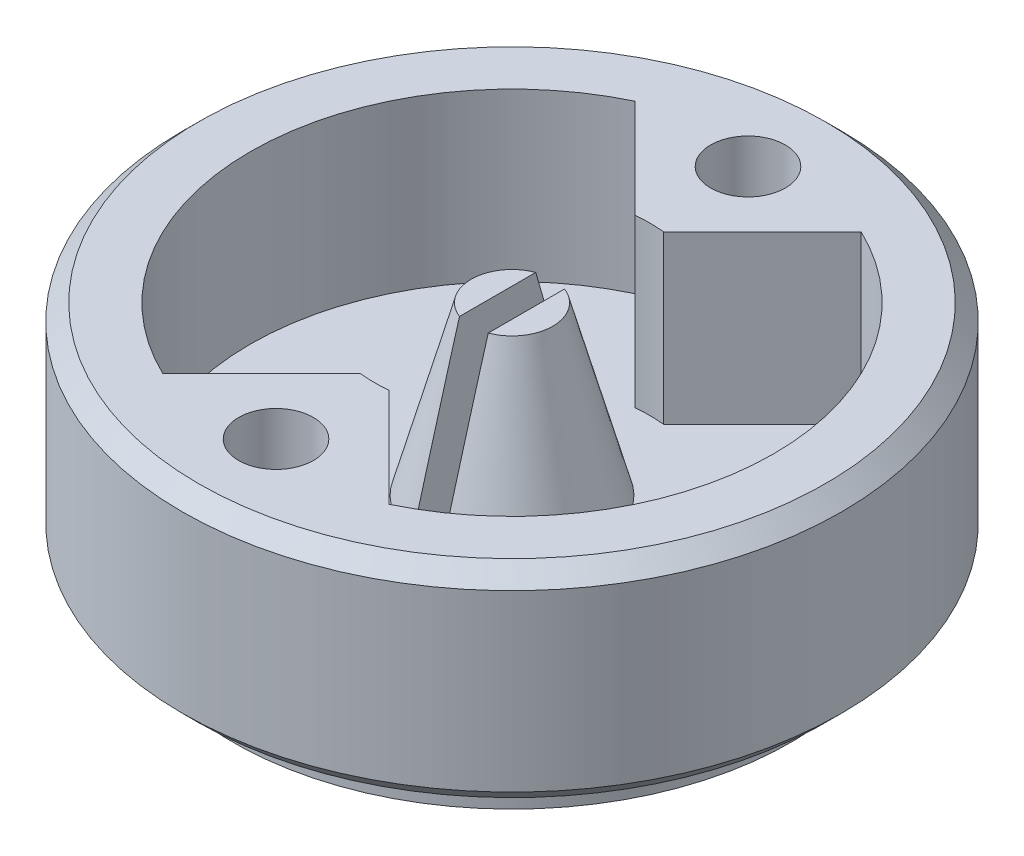
ISO-10303-21;
HEADER;
FILE_DESCRIPTION(('STEP AP214'),'2;1');
FILE_NAME('part.step','',(''),(''),'','','');
FILE_SCHEMA(('AUTOMOTIVE_DESIGN { 1 0 10303 214 1 1 1 1 }'));
ENDSEC;
DATA;
#1=APPLICATION_CONTEXT('core data for automotive mechanical design processes');
#2=APPLICATION_PROTOCOL_DEFINITION('international standard','automotive_design',2000,#1);
#3=PRODUCT_CONTEXT('',#1,'mechanical');
#4=PRODUCT('Part','Part','',(#3));
#5=PRODUCT_RELATED_PRODUCT_CATEGORY('part','',(#4));
#6=PRODUCT_DEFINITION_FORMATION('','',#4);
#7=PRODUCT_DEFINITION_CONTEXT('part definition',#1,'design');
#8=PRODUCT_DEFINITION('design','',#6,#7);
#9=PRODUCT_DEFINITION_SHAPE('','',#8);
#10=(LENGTH_UNIT() NAMED_UNIT(*) SI_UNIT(.MILLI.,.METRE.));
#11=(NAMED_UNIT(*) PLANE_ANGLE_UNIT() SI_UNIT($,.RADIAN.));
#12=(NAMED_UNIT(*) SI_UNIT($,.STERADIAN.) SOLID_ANGLE_UNIT());
#13=UNCERTAINTY_MEASURE_WITH_UNIT(LENGTH_MEASURE(1.E-05),#10,'distance_accuracy_value','');
#14=(GEOMETRIC_REPRESENTATION_CONTEXT(3) GLOBAL_UNCERTAINTY_ASSIGNED_CONTEXT((#13)) GLOBAL_UNIT_ASSIGNED_CONTEXT((#10,
#11,#12)) REPRESENTATION_CONTEXT('',''));
#15=CARTESIAN_POINT('',(0.,0.,0.));
#16=DIRECTION('',(0.,0.,1.));
#17=DIRECTION('',(1.,0.,0.));
#18=AXIS2_PLACEMENT_3D('',#15,#16,#17);
#19=CARTESIAN_POINT('',(0.,18.,0.));
#20=DIRECTION('',(0.,1.,0.));
#21=DIRECTION('',(0.,0.,1.));
#22=AXIS2_PLACEMENT_3D('',#19,#20,#21);
#23=PLANE('',#22);
#24=CARTESIAN_POINT('',(0.,18.,0.));
#25=DIRECTION('',(0.,-1.,0.));
#26=DIRECTION('',(0.,0.,-1.));
#27=AXIS2_PLACEMENT_3D('',#24,#25,#26);
#28=CIRCLE('',#27,27.2618644059249);
#29=CARTESIAN_POINT('',(0.,18.,-27.2618644059249));
#30=VERTEX_POINT('',#29);
#31=EDGE_CURVE('E173',#30,#30,#28,.T.);
#32=ORIENTED_EDGE('',*,*,#31,.F.);
#33=EDGE_LOOP('',(#32));
#34=FACE_BOUND('',#33,.T.);
#35=CARTESIAN_POINT('',(0.,18.,0.));
#36=DIRECTION('',(0.,-1.,0.));
#37=DIRECTION('',(0.,0.,-1.));
#38=AXIS2_PLACEMENT_3D('',#35,#36,#37);
#39=CIRCLE('',#38,22.7618644059249);
#40=CARTESIAN_POINT('',(9.84021095863013,18.,-20.52492922091));
#41=VERTEX_POINT('',#40);
#42=CARTESIAN_POINT('',(9.84021095863014,18.,20.52492922091));
#43=VERTEX_POINT('',#42);
#44=EDGE_CURVE('E170',#41,#43,#39,.T.);
#45=ORIENTED_EDGE('',*,*,#44,.T.);
#46=DIRECTION('',(-0.707106781186551,0.,-0.707106781186544));
#47=VECTOR('',#46,1.);
#48=CARTESIAN_POINT('',(-5.34235913113999,18.,5.34235913114004));
#49=LINE('',#48,#47);
#50=CARTESIAN_POINT('',(1.25000000000005,18.,11.93471826228));
#51=VERTEX_POINT('',#50);
#52=EDGE_CURVE('E551',#43,#51,#49,.T.);
#53=ORIENTED_EDGE('',*,*,#52,.T.);
#54=CARTESIAN_POINT('',(0.,18.,0.));
#55=DIRECTION('',(0.,1.,0.));
#56=DIRECTION('',(0.,0.,1.));
#57=AXIS2_PLACEMENT_3D('',#54,#55,#56);
#58=CIRCLE('',#57,12.);
#59=CARTESIAN_POINT('',(-1.24999999999998,18.,11.93471826228));
#60=VERTEX_POINT('',#59);
#61=EDGE_CURVE('E543',#60,#51,#58,.T.);
#62=ORIENTED_EDGE('',*,*,#61,.F.);
#63=DIRECTION('',(-0.707106781186542,0.,0.707106781186554));
#64=VECTOR('',#63,1.);
#65=CARTESIAN_POINT('',(5.34235913114,18.,5.34235913113991));
#66=LINE('',#65,#64);
#67=CARTESIAN_POINT('',(-9.84021095862984,18.,20.52492922091));
#68=VERTEX_POINT('',#67);
#69=EDGE_CURVE('E549',#60,#68,#66,.T.);
#70=ORIENTED_EDGE('',*,*,#69,.T.);
#71=CARTESIAN_POINT('',(-9.84021095862995,18.,-20.5249292209101));
#72=VERTEX_POINT('',#71);
#73=EDGE_CURVE('E67',#68,#72,#39,.T.);
#74=ORIENTED_EDGE('',*,*,#73,.T.);
#75=DIRECTION('',(-0.707106781186542,0.,-0.707106781186553));
#76=VECTOR('',#75,1.);
#77=CARTESIAN_POINT('',(5.34235913114,18.,-5.34235913113991));
#78=LINE('',#77,#76);
#79=CARTESIAN_POINT('',(-1.25,18.,-11.93471826228));
#80=VERTEX_POINT('',#79);
#81=EDGE_CURVE('E558',#80,#72,#78,.T.);
#82=ORIENTED_EDGE('',*,*,#81,.F.);
#83=CARTESIAN_POINT('',(0.,18.,0.));
#84=DIRECTION('',(0.,1.,0.));
#85=DIRECTION('',(0.,0.,1.));
#86=AXIS2_PLACEMENT_3D('',#83,#84,#85);
#87=CIRCLE('',#86,12.);
#88=CARTESIAN_POINT('',(1.25000000000003,18.,-11.93471826228));
#89=VERTEX_POINT('',#88);
#90=EDGE_CURVE('E573',#89,#80,#87,.T.);
#91=ORIENTED_EDGE('',*,*,#90,.F.);
#92=DIRECTION('',(-0.707106781186551,0.,0.707106781186544));
#93=VECTOR('',#92,1.);
#94=CARTESIAN_POINT('',(-5.34235913113999,18.,-5.34235913114005));
#95=LINE('',#94,#93);
#96=EDGE_CURVE('E567',#41,#89,#95,.T.);
#97=ORIENTED_EDGE('',*,*,#96,.F.);
#98=EDGE_LOOP('',(#45,#53,#62,#70,#74,#82,#91,#97));
#99=FACE_BOUND('',#98,.T.);
#100=CARTESIAN_POINT('',(0.,18.,20.52492922091));
#101=DIRECTION('',(0.,1.,0.));
#102=DIRECTION('',(0.,0.,1.));
#103=AXIS2_PLACEMENT_3D('',#100,#101,#102);
#104=CIRCLE('',#103,3.25);
#105=CARTESIAN_POINT('',(0.,18.,23.77492922091));
#106=VERTEX_POINT('',#105);
#107=EDGE_CURVE('E613',#106,#106,#104,.F.);
#108=ORIENTED_EDGE('',*,*,#107,.T.);
#109=EDGE_LOOP('',(#108));
#110=FACE_BOUND('',#109,.T.);
#111=CARTESIAN_POINT('',(0.,18.,-20.52492922091));
#112=DIRECTION('',(0.,1.,0.));
#113=DIRECTION('',(0.,0.,1.));
#114=AXIS2_PLACEMENT_3D('',#111,#112,#113);
#115=CIRCLE('',#114,3.25);
#116=CARTESIAN_POINT('',(0.,18.,-17.27492922091));
#117=VERTEX_POINT('',#116);
#118=EDGE_CURVE('E620',#117,#117,#115,.T.);
#119=ORIENTED_EDGE('',*,*,#118,.F.);
#120=EDGE_LOOP('',(#119));
#121=FACE_BOUND('',#120,.T.);
#122=ADVANCED_FACE('F44',(#34,#99,#110,#121),#23,.T.);
#123=CARTESIAN_POINT('',(0.,18.,0.));
#124=DIRECTION('',(0.,-1.,0.));
#125=DIRECTION('',(0.,0.,-1.));
#126=AXIS2_PLACEMENT_3D('',#123,#124,#125);
#127=CONICAL_SURFACE('',#126,3.54369181993519,0.266365196739861);
#128=CARTESIAN_POINT('',(1.25,3.4993,7.3952934322648));
#129=CARTESIAN_POINT('',(1.25,4.45329314270357,7.13127059292856));
#130=CARTESIAN_POINT('',(1.25,5.40720255819224,6.86694338370583));
#131=CARTESIAN_POINT('',(1.25,7.31477154853128,6.33723897187304));
#132=CARTESIAN_POINT('',(1.25,8.26843111163293,6.07186172696593));
#133=CARTESIAN_POINT('',(1.25,10.1747330378407,5.53980691039424));
#134=CARTESIAN_POINT('',(1.25,11.1273756619487,5.27313027462935));
#135=CARTESIAN_POINT('',(1.25,13.0319871729789,4.73751080979978));
#136=CARTESIAN_POINT('',(1.25,13.9839560832031,4.46856806372999));
#137=CARTESIAN_POINT('',(1.25,15.6277548364965,4.00059789871554));
#138=CARTESIAN_POINT('',(1.25,16.3198407799474,3.80247209016994));
#139=CARTESIAN_POINT('',(1.25,17.3573014233169,3.50284174178564));
#140=CARTESIAN_POINT('',(1.25,17.7030270721391,3.40255307842943));
#141=CARTESIAN_POINT('',(1.25,18.3941674806923,3.2009159733413));
#142=CARTESIAN_POINT('',(1.25,18.7395822420636,3.09956753723749));
#143=CARTESIAN_POINT('',(1.25,19.4303335853197,2.89536715572656));
#144=CARTESIAN_POINT('',(1.25,19.7756697635631,2.79251384238258));
#145=CARTESIAN_POINT('',(1.25,20.465767524908,2.58486777204445));
#146=CARTESIAN_POINT('',(1.25,20.8105290952731,2.48007497266808));
#147=CARTESIAN_POINT('',(1.25,21.4991419407665,2.26774344876135));
#148=CARTESIAN_POINT('',(1.25,21.8429933704595,2.16020522856318));
#149=CARTESIAN_POINT('',(1.25,22.3577448921765,1.99570760689359));
#150=CARTESIAN_POINT('',(1.25,22.5291546311892,1.94034440577836));
#151=CARTESIAN_POINT('',(1.25,22.8715243608268,1.82824633344843));
#152=CARTESIAN_POINT('',(1.25,23.0424843560559,1.77151147633694));
#153=CARTESIAN_POINT('',(1.25,23.3696534555649,1.66102315234274));
#154=CARTESIAN_POINT('',(1.25,23.525910643937,1.60741236609595));
#155=CARTESIAN_POINT('',(1.25,23.8377504152969,1.49818723410803));
#156=CARTESIAN_POINT('',(1.25,23.9933329052503,1.44257262132011));
#157=CARTESIAN_POINT('',(1.25,24.3031157753466,1.328736092269));
#158=CARTESIAN_POINT('',(1.25,24.4573185927473,1.27052082835048));
#159=CARTESIAN_POINT('',(1.25,24.7641658070413,1.15018609727513));
#160=CARTESIAN_POINT('',(1.25,24.9168106652295,1.08806782718009));
#161=CARTESIAN_POINT('',(1.25,25.14379069964,0.990256861289361));
#162=CARTESIAN_POINT('',(1.25,25.2191211023561,0.956880177580543));
#163=CARTESIAN_POINT('',(1.25,25.3688899125784,0.888067727359053));
#164=CARTESIAN_POINT('',(1.25,25.4433278568597,0.852630943011569));
#165=CARTESIAN_POINT('',(1.25,25.5914007039442,0.778709665123685));
#166=CARTESIAN_POINT('',(1.25,25.6650249645907,0.740203747183918));
#167=CARTESIAN_POINT('',(1.25,25.8100179363024,0.6592361454528));
#168=CARTESIAN_POINT('',(1.25,25.8813892503439,0.616779268577595));
#169=CARTESIAN_POINT('',(1.25,25.9860364407537,0.548062264597413));
#170=CARTESIAN_POINT('',(1.25,26.0208054494018,0.52408943059186));
#171=CARTESIAN_POINT('',(1.25,26.0888001084982,0.474062108773271));
#172=CARTESIAN_POINT('',(1.25,26.1220268424928,0.448009118509891));
#173=CARTESIAN_POINT('',(1.25,26.1857763471452,0.393469494200129));
#174=CARTESIAN_POINT('',(1.25,26.2163262586973,0.36501498385562));
#175=CARTESIAN_POINT('',(1.25,26.2736373946249,0.304570992293455));
#176=CARTESIAN_POINT('',(1.25,26.3004140029456,0.272596870960671));
#177=CARTESIAN_POINT('',(1.25,26.3374444570585,0.218633035072382));
#178=CARTESIAN_POINT('',(1.25,26.3498871603621,0.198166418295633));
#179=CARTESIAN_POINT('',(1.25,26.3717211140972,0.155643866534408));
#180=CARTESIAN_POINT('',(1.25,26.3811160833548,0.133589908888832));
#181=CARTESIAN_POINT('',(1.25,26.3946408286502,0.0918110846279598));
#182=CARTESIAN_POINT('',(1.25,26.3993763016914,0.0722861698110284));
#183=CARTESIAN_POINT('',(1.25,26.4054584317507,0.0327125997570509));
#184=CARTESIAN_POINT('',(1.25,26.4068077829203,0.0126643737319906));
#185=CARTESIAN_POINT('',(1.25,26.4059460718824,-0.0273704585456099));
#186=CARTESIAN_POINT('',(1.25,26.4037319139935,-0.047356996092973));
#187=CARTESIAN_POINT('',(1.25,26.3960202495719,-0.0866827197909602));
#188=CARTESIAN_POINT('',(1.25,26.390519519625,-0.106021250696586));
#189=CARTESIAN_POINT('',(1.25,26.3739685410517,-0.151461337818528));
#190=CARTESIAN_POINT('',(1.25,26.3615651844143,-0.177062840793413));
#191=CARTESIAN_POINT('',(1.25,26.3329922173547,-0.226059913192202));
#192=CARTESIAN_POINT('',(1.25,26.3168121477583,-0.2494490983553));
#193=CARTESIAN_POINT('',(1.25,26.2784374034056,-0.298722125521233));
#194=CARTESIAN_POINT('',(1.25,26.2556872732781,-0.324165458143727));
#195=CARTESIAN_POINT('',(1.25,26.2078454974039,-0.372775354625058));
#196=CARTESIAN_POINT('',(1.25,26.1827495910149,-0.3959376123436));
#197=CARTESIAN_POINT('',(1.25,26.1308561588798,-0.440564761548905));
#198=CARTESIAN_POINT('',(1.25,26.1040496461681,-0.462019082336465));
#199=CARTESIAN_POINT('',(1.25,26.0493587274215,-0.503436606338791));
#200=CARTESIAN_POINT('',(1.25,26.0214753171786,-0.523401139307184));
#201=CARTESIAN_POINT('',(1.25,25.9365648177586,-0.581582035865382));
#202=CARTESIAN_POINT('',(1.25,25.8783360330238,-0.618038018577595));
#203=CARTESIAN_POINT('',(1.25,25.7599900439467,-0.687769339461614));
#204=CARTESIAN_POINT('',(1.25,25.6998713981146,-0.721042167438114));
#205=CARTESIAN_POINT('',(1.25,25.5782679143295,-0.785332977391055));
#206=CARTESIAN_POINT('',(1.25,25.5167802264391,-0.816345540272672));
#207=CARTESIAN_POINT('',(1.25,25.3929409828305,-0.876602443609581));
#208=CARTESIAN_POINT('',(1.25,25.3305893044069,-0.905846529672531));
#209=CARTESIAN_POINT('',(1.25,25.1423744911498,-0.991632853502969));
#210=CARTESIAN_POINT('',(1.25,25.0155748933183,-1.0461153649464));
#211=CARTESIAN_POINT('',(1.25,24.7607201092281,-1.15142010625163));
#212=CARTESIAN_POINT('',(1.25,24.6326671729812,-1.20224787699042));
#213=CARTESIAN_POINT('',(1.25,24.3770779864601,-1.30080007055939));
#214=CARTESIAN_POINT('',(1.25,24.2495529298666,-1.34855361863595));
#215=CARTESIAN_POINT('',(1.25,23.9938299243563,-1.44222432480535));
#216=CARTESIAN_POINT('',(1.25,23.865631957352,-1.48814143324685));
#217=CARTESIAN_POINT('',(1.25,23.4802676481531,-1.62381307820599));
#218=CARTESIAN_POINT('',(1.25,23.2223657638999,-1.71147480188052));
#219=CARTESIAN_POINT('',(1.25,22.70513759817,-1.8833551318552));
#220=CARTESIAN_POINT('',(1.25,22.4458101330794,-1.96757013880244));
#221=CARTESIAN_POINT('',(1.25,21.9263950402684,-2.13354752134459));
#222=CARTESIAN_POINT('',(1.25,21.6663074727229,-2.21531008561203));
#223=CARTESIAN_POINT('',(1.25,21.1464717095007,-2.37679956383062));
#224=CARTESIAN_POINT('',(1.25,20.8867253635598,-2.45653245069747));
#225=CARTESIAN_POINT('',(1.25,20.3668280425551,-2.61468412217061));
#226=CARTESIAN_POINT('',(1.25,20.1066770597969,-2.69310288144597));
#227=CARTESIAN_POINT('',(1.25,19.3260157876467,-2.92678323830182));
#228=CARTESIAN_POINT('',(1.25,18.8050563641951,-3.08054302318001));
#229=CARTESIAN_POINT('',(1.25,17.6706431029236,-3.41238678739448));
#230=CARTESIAN_POINT('',(1.25,17.0570487388205,-3.58998855149975));
#231=CARTESIAN_POINT('',(1.25,15.8292169190069,-3.94296391290975));
#232=CARTESIAN_POINT('',(1.25,15.2149794598472,-4.11833749819702));
#233=CARTESIAN_POINT('',(1.25,13.9859483138426,-4.46760175883543));
#234=CARTESIAN_POINT('',(1.25,13.3711545391543,-4.64149212470556));
#235=CARTESIAN_POINT('',(1.25,12.1412617675806,-4.98819032194211));
#236=CARTESIAN_POINT('',(1.25,11.5261627705709,-5.16099815286759));
#237=CARTESIAN_POINT('',(1.25,10.2935698562936,-5.50642259879439));
#238=CARTESIAN_POINT('',(1.25,9.67607514727437,-5.67903638718016));
#239=CARTESIAN_POINT('',(1.25,8.44091461118115,-6.02365218597502));
#240=CARTESIAN_POINT('',(1.25,7.82324878398314,-6.19565419593941));
#241=CARTESIAN_POINT('',(1.25,6.58792830825432,-6.53914387442955));
#242=CARTESIAN_POINT('',(1.25,5.97027369027702,-6.71063165286946));
#243=CARTESIAN_POINT('',(1.25,4.73485933911552,-7.05322553673009));
#244=CARTESIAN_POINT('',(1.25,4.11709960604855,-7.22433164257355));
#245=CARTESIAN_POINT('',(1.25,3.4993,-7.3952934322648));
#246=B_SPLINE_CURVE_WITH_KNOTS('',3,(#128,#129,#130,#131,#132,#133,#134,#135,#136,#137,#138,
#139,#140,#141,#142,#143,#144,#145,#146,#147,#148,#149,#150,#151,#152,#153,#154,#155,#156,#157,
#158,#159,#160,#161,#162,#163,#164,#165,#166,#167,#168,#169,#170,#171,#172,#173,#174,#175,#176,
#177,#178,#179,#180,#181,#182,#183,#184,#185,#186,#187,#188,#189,#190,#191,#192,#193,#194,#195,
#196,#197,#198,#199,#200,#201,#202,#203,#204,#205,#206,#207,#208,#209,#210,#211,#212,#213,#214,
#215,#216,#217,#218,#219,#220,#221,#222,#223,#224,#225,#226,#227,#228,#229,#230,#231,#232,#233,
#234,#235,#236,#237,#238,#239,#240,#241,#242,#243,#244,#245),.UNSPECIFIED.,.F.,.F.,(4,2,2,2,2,2,
2,2,2,2,2,2,2,2,2,2,2,2,2,2,2,2,2,2,2,2,2,2,2,2,2,2,2,2,2,2,2,2,2,2,2,2,2,2,2,2,2,2,2,2,2,2,2,2,
2,2,2,2,4),(0.,2.96956275770835,5.93924637715721,8.90703847184335,11.8747223413883,
14.0343765261525,15.114308761757,16.1942352650968,17.2752133403829,18.3562150654735,
19.4370196201195,19.9774018857799,20.5177785976506,21.013363741833,21.5090151779442,
22.0034642139828,22.4977623345886,22.744922035084,22.9922049051866,23.2413975961472,
23.4902909758847,23.6169352443178,23.7434891469467,23.8685588901054,23.9931029735038,
24.0647800254171,24.1363692855605,24.1963837039173,24.2563503569289,24.3163691321242,
24.3764468695705,24.4613016351102,24.5463942443301,24.6485533217649,24.7509016967526,
24.8538409217796,24.9566871382169,25.1626053223617,25.3686845750762,25.5752426813055,
25.7818304302276,26.1957570707987,26.6090423224994,27.0175408085974,27.4260503317064,
28.2431811216231,29.0611445208359,29.8790448298347,30.694166002266,31.5093028688237,
33.1388207599046,35.0551562379719,36.9715020472298,38.8882383830291,40.8049754995254,
42.728476364635,44.6519786276128,46.5750353249918,48.4980898912332),.UNSPECIFIED.);
#247=CARTESIAN_POINT('',(1.25,3.5,7.39509972887452));
#248=VERTEX_POINT('',#247);
#249=CARTESIAN_POINT('',(1.25,18.,3.31590888214311));
#250=VERTEX_POINT('',#249);
#251=EDGE_CURVE('E539',#248,#250,#246,.T.);
#252=ORIENTED_EDGE('',*,*,#251,.F.);
#253=CARTESIAN_POINT('',(0.,3.5,0.));
#254=DIRECTION('',(0.,-1.,0.));
#255=DIRECTION('',(0.,0.,-1.));
#256=AXIS2_PLACEMENT_3D('',#253,#254,#255);
#257=CIRCLE('',#256,7.5);
#258=CARTESIAN_POINT('',(1.25,3.5,-7.39509972887452));
#259=VERTEX_POINT('',#258);
#260=EDGE_CURVE('E165',#259,#248,#257,.T.);
#261=ORIENTED_EDGE('',*,*,#260,.F.);
#262=CARTESIAN_POINT('',(1.25,18.,-3.31590888214311));
#263=VERTEX_POINT('',#262);
#264=EDGE_CURVE('E531',#263,#259,#246,.T.);
#265=ORIENTED_EDGE('',*,*,#264,.F.);
#266=CARTESIAN_POINT('',(0.,18.,0.));
#267=DIRECTION('',(0.,-1.,0.));
#268=DIRECTION('',(0.,0.,-1.));
#269=AXIS2_PLACEMENT_3D('',#266,#267,#268);
#270=CIRCLE('',#269,3.54369181993519);
#271=EDGE_CURVE('E153',#263,#250,#270,.T.);
#272=ORIENTED_EDGE('',*,*,#271,.T.);
#273=EDGE_LOOP('',(#252,#261,#265,#272));
#274=FACE_BOUND('',#273,.T.);
#275=ADVANCED_FACE('F211',(#274),#127,.T.);
#276=CARTESIAN_POINT('',(-1.25,3.4993,-7.3952934322648));
#277=CARTESIAN_POINT('',(-1.25,4.45329314270357,-7.13127059292856));
#278=CARTESIAN_POINT('',(-1.25,5.40720255819224,-6.86694338370583));
#279=CARTESIAN_POINT('',(-1.25,7.31477154853128,-6.33723897187305));
#280=CARTESIAN_POINT('',(-1.25,8.26843111163294,-6.07186172696593));
#281=CARTESIAN_POINT('',(-1.25,10.1747330378407,-5.53980691039423));
#282=CARTESIAN_POINT('',(-1.25,11.1273756619487,-5.27313027462935));
#283=CARTESIAN_POINT('',(-1.25,13.0319871729789,-4.73751080979978));
#284=CARTESIAN_POINT('',(-1.25,13.9839560832031,-4.46856806372999));
#285=CARTESIAN_POINT('',(-1.25,15.6277548364965,-4.00059789871554));
#286=CARTESIAN_POINT('',(-1.25,16.3198407799474,-3.80247209016994));
#287=CARTESIAN_POINT('',(-1.25,17.3573014233169,-3.50284174178564));
#288=CARTESIAN_POINT('',(-1.25,17.7030270721391,-3.40255307842943));
#289=CARTESIAN_POINT('',(-1.25,18.3941674806923,-3.2009159733413));
#290=CARTESIAN_POINT('',(-1.25,18.7395822420637,-3.09956753723749));
#291=CARTESIAN_POINT('',(-1.25,19.4303335853197,-2.89536715572656));
#292=CARTESIAN_POINT('',(-1.25,19.7756697635631,-2.79251384238258));
#293=CARTESIAN_POINT('',(-1.25,20.465767524908,-2.58486777204445));
#294=CARTESIAN_POINT('',(-1.25,20.8105290952731,-2.48007497266807));
#295=CARTESIAN_POINT('',(-1.25,21.4991419407665,-2.26774344876135));
#296=CARTESIAN_POINT('',(-1.25,21.8429933704595,-2.16020522856318));
#297=CARTESIAN_POINT('',(-1.25,22.3577448921765,-1.99570760689359));
#298=CARTESIAN_POINT('',(-1.25,22.5291546311892,-1.94034440577836));
#299=CARTESIAN_POINT('',(-1.25,22.8715243608268,-1.82824633344843));
#300=CARTESIAN_POINT('',(-1.25,23.042484356056,-1.77151147633694));
#301=CARTESIAN_POINT('',(-1.25,23.3696534555649,-1.66102315234274));
#302=CARTESIAN_POINT('',(-1.25,23.525910643937,-1.60741236609595));
#303=CARTESIAN_POINT('',(-1.25,23.8377504152969,-1.49818723410803));
#304=CARTESIAN_POINT('',(-1.25,23.9933329052503,-1.44257262132011));
#305=CARTESIAN_POINT('',(-1.25,24.3031157753466,-1.328736092269));
#306=CARTESIAN_POINT('',(-1.25,24.4573185927473,-1.27052082835048));
#307=CARTESIAN_POINT('',(-1.25,24.7641658070413,-1.15018609727513));
#308=CARTESIAN_POINT('',(-1.25,24.9168106652295,-1.08806782718009));
#309=CARTESIAN_POINT('',(-1.25,25.14379069964,-0.990256861289357));
#310=CARTESIAN_POINT('',(-1.25,25.2191211023561,-0.956880177580541));
#311=CARTESIAN_POINT('',(-1.25,25.3688899125784,-0.888067727359052));
#312=CARTESIAN_POINT('',(-1.25,25.4433278568597,-0.852630943011567));
#313=CARTESIAN_POINT('',(-1.25,25.5914007039442,-0.778709665123684));
#314=CARTESIAN_POINT('',(-1.25,25.6650249645907,-0.740203747183917));
#315=CARTESIAN_POINT('',(-1.25,25.8100179363024,-0.6592361454528));
#316=CARTESIAN_POINT('',(-1.25,25.8813892503439,-0.616779268577594));
#317=CARTESIAN_POINT('',(-1.25,25.9860364407537,-0.548062264597412));
#318=CARTESIAN_POINT('',(-1.25,26.0208054494018,-0.52408943059186));
#319=CARTESIAN_POINT('',(-1.25,26.0888001084982,-0.474062108773271));
#320=CARTESIAN_POINT('',(-1.25,26.1220268424927,-0.44800911850989));
#321=CARTESIAN_POINT('',(-1.25,26.1857763471452,-0.39346949420013));
#322=CARTESIAN_POINT('',(-1.25,26.2163262586973,-0.365014983855621));
#323=CARTESIAN_POINT('',(-1.25,26.2736373946249,-0.304570992293457));
#324=CARTESIAN_POINT('',(-1.25,26.3004140029456,-0.272596870960672));
#325=CARTESIAN_POINT('',(-1.25,26.3374444570585,-0.218633035072383));
#326=CARTESIAN_POINT('',(-1.25,26.3498871603621,-0.198166418295636));
#327=CARTESIAN_POINT('',(-1.25,26.3717211140972,-0.155643866534411));
#328=CARTESIAN_POINT('',(-1.25,26.3811160833548,-0.133589908888833));
#329=CARTESIAN_POINT('',(-1.25,26.3946408286502,-0.0918110846279603));
#330=CARTESIAN_POINT('',(-1.25,26.3993763016914,-0.0722861698110291));
#331=CARTESIAN_POINT('',(-1.25,26.4054584317507,-0.0327125997570515));
#332=CARTESIAN_POINT('',(-1.25,26.4068077829203,-0.0126643737319912));
#333=CARTESIAN_POINT('',(-1.25,26.4059460718824,0.0273704585456081));
#334=CARTESIAN_POINT('',(-1.25,26.4037319139935,0.04735699609297));
#335=CARTESIAN_POINT('',(-1.25,26.3960202495719,0.0866827197909572));
#336=CARTESIAN_POINT('',(-1.25,26.390519519625,0.106021250696585));
#337=CARTESIAN_POINT('',(-1.25,26.3739685410517,0.151461337818528));
#338=CARTESIAN_POINT('',(-1.25,26.3615651844143,0.177062840793414));
#339=CARTESIAN_POINT('',(-1.25,26.3329922173547,0.226059913192203));
#340=CARTESIAN_POINT('',(-1.25,26.3168121477583,0.2494490983553));
#341=CARTESIAN_POINT('',(-1.25,26.2784374034056,0.298722125521236));
#342=CARTESIAN_POINT('',(-1.25,26.2556872732781,0.324165458143732));
#343=CARTESIAN_POINT('',(-1.25,26.2078454974039,0.372775354625064));
#344=CARTESIAN_POINT('',(-1.25,26.1827495910149,0.395937612343602));
#345=CARTESIAN_POINT('',(-1.25,26.1308561588798,0.440564761548904));
#346=CARTESIAN_POINT('',(-1.25,26.1040496461681,0.462019082336464));
#347=CARTESIAN_POINT('',(-1.25,26.0493587274215,0.50343660633879));
#348=CARTESIAN_POINT('',(-1.25,26.0214753171786,0.523401139307183));
#349=CARTESIAN_POINT('',(-1.25,25.9365648177586,0.58158203586538));
#350=CARTESIAN_POINT('',(-1.25,25.8783360330238,0.618038018577592));
#351=CARTESIAN_POINT('',(-1.25,25.7599900439467,0.68776933946161));
#352=CARTESIAN_POINT('',(-1.25,25.6998713981146,0.721042167438111));
#353=CARTESIAN_POINT('',(-1.25,25.5782679143295,0.785332977391053));
#354=CARTESIAN_POINT('',(-1.25,25.5167802264391,0.816345540272672));
#355=CARTESIAN_POINT('',(-1.25,25.3929409828305,0.876602443609581));
#356=CARTESIAN_POINT('',(-1.25,25.3305893044069,0.90584652967253));
#357=CARTESIAN_POINT('',(-1.25,25.1423744911498,0.991632853502965));
#358=CARTESIAN_POINT('',(-1.25,25.0155748933183,1.0461153649464));
#359=CARTESIAN_POINT('',(-1.25,24.7607201092281,1.15142010625163));
#360=CARTESIAN_POINT('',(-1.25,24.6326671729812,1.20224787699041));
#361=CARTESIAN_POINT('',(-1.25,24.3770779864601,1.30080007055939));
#362=CARTESIAN_POINT('',(-1.25,24.2495529298666,1.34855361863595));
#363=CARTESIAN_POINT('',(-1.25,23.9938299243563,1.44222432480535));
#364=CARTESIAN_POINT('',(-1.25,23.8656319573521,1.48814143324685));
#365=CARTESIAN_POINT('',(-1.25,23.4802676481531,1.62381307820598));
#366=CARTESIAN_POINT('',(-1.25,23.2223657639,1.71147480188052));
#367=CARTESIAN_POINT('',(-1.25,22.70513759817,1.88335513185519));
#368=CARTESIAN_POINT('',(-1.25,22.4458101330794,1.96757013880243));
#369=CARTESIAN_POINT('',(-1.25,21.9263950402684,2.13354752134458));
#370=CARTESIAN_POINT('',(-1.25,21.6663074727229,2.21531008561203));
#371=CARTESIAN_POINT('',(-1.25,21.1464717095008,2.37679956383061));
#372=CARTESIAN_POINT('',(-1.25,20.8867253635598,2.45653245069746));
#373=CARTESIAN_POINT('',(-1.25,20.3668280425551,2.6146841221706));
#374=CARTESIAN_POINT('',(-1.25,20.1066770597969,2.69310288144595));
#375=CARTESIAN_POINT('',(-1.25,19.3260157876468,2.92678323830181));
#376=CARTESIAN_POINT('',(-1.25,18.8050563641952,3.08054302318));
#377=CARTESIAN_POINT('',(-1.25,17.6706431029237,3.41238678739446));
#378=CARTESIAN_POINT('',(-1.25,17.0570487388206,3.58998855149973));
#379=CARTESIAN_POINT('',(-1.25,15.8292169190069,3.94296391290974));
#380=CARTESIAN_POINT('',(-1.25,15.2149794598473,4.11833749819701));
#381=CARTESIAN_POINT('',(-1.25,13.9859483138426,4.46760175883542));
#382=CARTESIAN_POINT('',(-1.25,13.3711545391544,4.64149212470555));
#383=CARTESIAN_POINT('',(-1.25,12.1412617675807,4.9881903219421));
#384=CARTESIAN_POINT('',(-1.25,11.526162770571,5.16099815286758));
#385=CARTESIAN_POINT('',(-1.25,10.2935698562936,5.50642259879438));
#386=CARTESIAN_POINT('',(-1.25,9.67607514727438,5.67903638718015));
#387=CARTESIAN_POINT('',(-1.25,8.44091461118116,6.02365218597501));
#388=CARTESIAN_POINT('',(-1.25,7.82324878398315,6.19565419593941));
#389=CARTESIAN_POINT('',(-1.25,6.58792830825432,6.53914387442955));
#390=CARTESIAN_POINT('',(-1.25,5.97027369027703,6.71063165286946));
#391=CARTESIAN_POINT('',(-1.25,4.73485933911552,7.05322553673009));
#392=CARTESIAN_POINT('',(-1.25,4.11709960604855,7.22433164257355));
#393=CARTESIAN_POINT('',(-1.25,3.4993,7.3952934322648));
#394=B_SPLINE_CURVE_WITH_KNOTS('',3,(#276,#277,#278,#279,#280,#281,#282,#283,#284,#285,#286,
#287,#288,#289,#290,#291,#292,#293,#294,#295,#296,#297,#298,#299,#300,#301,#302,#303,#304,#305,
#306,#307,#308,#309,#310,#311,#312,#313,#314,#315,#316,#317,#318,#319,#320,#321,#322,#323,#324,
#325,#326,#327,#328,#329,#330,#331,#332,#333,#334,#335,#336,#337,#338,#339,#340,#341,#342,#343,
#344,#345,#346,#347,#348,#349,#350,#351,#352,#353,#354,#355,#356,#357,#358,#359,#360,#361,#362,
#363,#364,#365,#366,#367,#368,#369,#370,#371,#372,#373,#374,#375,#376,#377,#378,#379,#380,#381,
#382,#383,#384,#385,#386,#387,#388,#389,#390,#391,#392,#393),.UNSPECIFIED.,.F.,.F.,(4,2,2,2,2,2,
2,2,2,2,2,2,2,2,2,2,2,2,2,2,2,2,2,2,2,2,2,2,2,2,2,2,2,2,2,2,2,2,2,2,2,2,2,2,2,2,2,2,2,2,2,2,2,2,
2,2,2,2,4),(0.,2.96956275770835,5.93924637715721,8.90703847184335,11.8747223413883,
14.0343765261525,15.114308761757,16.1942352650968,17.2752133403829,18.3562150654735,
19.4370196201195,19.9774018857799,20.5177785976506,21.013363741833,21.5090151779442,
22.0034642139828,22.4977623345886,22.744922035084,22.9922049051866,23.2413975961472,
23.4902909758847,23.6169352443178,23.7434891469467,23.8685588901054,23.9931029735038,
24.0647800254171,24.1363692855605,24.1963837039173,24.2563503569289,24.3163691321242,
24.3764468695705,24.4613016351102,24.5463942443301,24.6485533217649,24.7509016967526,
24.8538409217796,24.9566871382169,25.1626053223617,25.3686845750762,25.5752426813055,
25.7818304302276,26.1957570707987,26.6090423224994,27.0175408085974,27.4260503317064,
28.2431811216231,29.0611445208359,29.8790448298347,30.6941660022659,31.5093028688237,
33.1388207599045,35.0551562379719,36.9715020472298,38.8882383830291,40.8049754995254,
42.728476364635,44.6519786276128,46.5750353249918,48.4980898912332),.UNSPECIFIED.);
#395=CARTESIAN_POINT('',(-1.25,3.5,-7.39509972887452));
#396=VERTEX_POINT('',#395);
#397=CARTESIAN_POINT('',(-1.25,18.,-3.31590888214311));
#398=VERTEX_POINT('',#397);
#399=EDGE_CURVE('E140',#396,#398,#394,.T.);
#400=ORIENTED_EDGE('',*,*,#399,.F.);
#401=CARTESIAN_POINT('',(-1.25,3.5,7.39509972887452));
#402=VERTEX_POINT('',#401);
#403=EDGE_CURVE('E149',#402,#396,#257,.T.);
#404=ORIENTED_EDGE('',*,*,#403,.F.);
#405=CARTESIAN_POINT('',(-1.25,18.,3.31590888214311));
#406=VERTEX_POINT('',#405);
#407=EDGE_CURVE('E137',#406,#402,#394,.T.);
#408=ORIENTED_EDGE('',*,*,#407,.F.);
#409=EDGE_CURVE('E147',#406,#398,#270,.T.);
#410=ORIENTED_EDGE('',*,*,#409,.T.);
#411=EDGE_LOOP('',(#400,#404,#408,#410));
#412=FACE_BOUND('',#411,.T.);
#413=ADVANCED_FACE('F146',(#412),#127,.T.);
#414=CARTESIAN_POINT('',(0.,18.,0.));
#415=DIRECTION('',(0.,-1.,0.));
#416=DIRECTION('',(0.,0.,-1.));
#417=AXIS2_PLACEMENT_3D('',#414,#415,#416);
#418=PLANE('',#417);
#419=DIRECTION('',(0.,0.,-1.));
#420=VECTOR('',#419,1.);
#421=CARTESIAN_POINT('',(1.25,18.,0.));
#422=LINE('',#421,#420);
#423=EDGE_CURVE('E12',#250,#263,#422,.T.);
#424=ORIENTED_EDGE('',*,*,#423,.F.);
#425=ORIENTED_EDGE('',*,*,#271,.F.);
#426=EDGE_LOOP('',(#424,#425));
#427=FACE_BOUND('',#426,.T.);
#428=ADVANCED_FACE('F355',(#427),#418,.F.);
#429=DIRECTION('',(0.,0.,1.));
#430=VECTOR('',#429,1.);
#431=CARTESIAN_POINT('',(-1.25,18.,0.));
#432=LINE('',#431,#430);
#433=EDGE_CURVE('E52',#398,#406,#432,.T.);
#434=ORIENTED_EDGE('',*,*,#433,.F.);
#435=ORIENTED_EDGE('',*,*,#409,.F.);
#436=EDGE_LOOP('',(#434,#435));
#437=FACE_BOUND('',#436,.T.);
#438=ADVANCED_FACE('F152',(#437),#418,.F.);
#439=CARTESIAN_POINT('',(0.,0.,0.));
#440=DIRECTION('',(0.,-1.,0.));
#441=DIRECTION('',(0.,0.,-1.));
#442=AXIS2_PLACEMENT_3D('',#439,#440,#441);
#443=CYLINDRICAL_SURFACE('',#442,22.7618644059249);
#444=CARTESIAN_POINT('',(0.,3.50000000000001,0.));
#445=DIRECTION('',(0.,-1.,0.));
#446=DIRECTION('',(0.,0.,-1.));
#447=AXIS2_PLACEMENT_3D('',#444,#445,#446);
#448=CIRCLE('',#447,22.7618644059249);
#449=CARTESIAN_POINT('',(9.84021095863013,3.50000000000001,-20.52492922091));
#450=VERTEX_POINT('',#449);
#451=CARTESIAN_POINT('',(9.84021095863014,3.50000000000001,20.52492922091));
#452=VERTEX_POINT('',#451);
#453=EDGE_CURVE('E166',#450,#452,#448,.T.);
#454=ORIENTED_EDGE('',*,*,#453,.T.);
#455=DIRECTION('',(0.,1.,0.));
#456=VECTOR('',#455,1.);
#457=CARTESIAN_POINT('',(9.84021095863014,3.5,20.52492922091));
#458=LINE('',#457,#456);
#459=EDGE_CURVE('E59',#452,#43,#458,.T.);
#460=ORIENTED_EDGE('',*,*,#459,.T.);
#461=ORIENTED_EDGE('',*,*,#44,.F.);
#462=DIRECTION('',(0.,1.,0.));
#463=VECTOR('',#462,1.);
#464=CARTESIAN_POINT('',(9.84021095863013,3.5,-20.52492922091));
#465=LINE('',#464,#463);
#466=EDGE_CURVE('E154',#450,#41,#465,.T.);
#467=ORIENTED_EDGE('',*,*,#466,.F.);
#468=EDGE_LOOP('',(#454,#460,#461,#467));
#469=FACE_BOUND('',#468,.T.);
#470=ADVANCED_FACE('F279',(#469),#443,.F.);
#471=DIRECTION('',(0.,1.,0.));
#472=VECTOR('',#471,1.);
#473=CARTESIAN_POINT('',(-9.84021095862984,3.5,20.52492922091));
#474=LINE('',#473,#472);
#475=CARTESIAN_POINT('',(-9.84021095862984,3.5,20.52492922091));
#476=VERTEX_POINT('',#475);
#477=EDGE_CURVE('E548',#476,#68,#474,.T.);
#478=ORIENTED_EDGE('',*,*,#477,.F.);
#479=CARTESIAN_POINT('',(-9.84021095862986,3.50000000000001,-20.5249292209101));
#480=VERTEX_POINT('',#479);
#481=EDGE_CURVE('E169',#476,#480,#448,.T.);
#482=ORIENTED_EDGE('',*,*,#481,.T.);
#483=DIRECTION('',(0.,1.,0.));
#484=VECTOR('',#483,1.);
#485=CARTESIAN_POINT('',(-9.84021095862986,3.5,-20.52492922091));
#486=LINE('',#485,#484);
#487=EDGE_CURVE('E162',#480,#72,#486,.T.);
#488=ORIENTED_EDGE('',*,*,#487,.T.);
#489=ORIENTED_EDGE('',*,*,#73,.F.);
#490=EDGE_LOOP('',(#478,#482,#488,#489));
#491=FACE_BOUND('',#490,.T.);
#492=ADVANCED_FACE('F209',(#491),#443,.F.);
#493=CARTESIAN_POINT('',(0.,0.,0.));
#494=DIRECTION('',(0.,-1.,0.));
#495=DIRECTION('',(0.,0.,-1.));
#496=AXIS2_PLACEMENT_3D('',#493,#494,#495);
#497=PLANE('',#496);
#498=CARTESIAN_POINT('',(0.,0.,0.));
#499=DIRECTION('',(0.,-1.,0.));
#500=DIRECTION('',(0.,0.,-1.));
#501=AXIS2_PLACEMENT_3D('',#498,#499,#500);
#502=CIRCLE('',#501,10.75);
#503=CARTESIAN_POINT('',(0.,0.,-10.75));
#504=VERTEX_POINT('',#503);
#505=EDGE_CURVE('E144',#504,#504,#502,.T.);
#506=ORIENTED_EDGE('',*,*,#505,.T.);
#507=EDGE_LOOP('',(#506));
#508=FACE_BOUND('',#507,.T.);
#509=ADVANCED_FACE('F46',(#508),#497,.T.);
#510=CARTESIAN_POINT('',(0.,0.,0.));
#511=DIRECTION('',(0.,-1.,0.));
#512=DIRECTION('',(0.,0.,-1.));
#513=AXIS2_PLACEMENT_3D('',#510,#511,#512);
#514=CYLINDRICAL_SURFACE('',#513,10.75);
#515=CARTESIAN_POINT('',(0.,-3.,0.));
#516=DIRECTION('',(0.,-1.,0.));
#517=DIRECTION('',(0.,0.,-1.));
#518=AXIS2_PLACEMENT_3D('',#515,#516,#517);
#519=CIRCLE('',#518,10.75);
#520=CARTESIAN_POINT('',(0.,-3.,-10.75));
#521=VERTEX_POINT('',#520);
#522=EDGE_CURVE('E191',#521,#521,#519,.T.);
#523=ORIENTED_EDGE('',*,*,#522,.T.);
#524=EDGE_LOOP('',(#523));
#525=FACE_BOUND('',#524,.T.);
#526=ORIENTED_EDGE('',*,*,#505,.F.);
#527=EDGE_LOOP('',(#526));
#528=FACE_BOUND('',#527,.T.);
#529=ADVANCED_FACE('F198',(#525,#528),#514,.F.);
#530=CARTESIAN_POINT('',(0.,-3.,0.));
#531=DIRECTION('',(0.,-1.,0.));
#532=DIRECTION('',(0.,0.,-1.));
#533=AXIS2_PLACEMENT_3D('',#530,#531,#532);
#534=PLANE('',#533);
#535=CARTESIAN_POINT('',(0.,-3.,0.));
#536=DIRECTION('',(0.,-1.,0.));
#537=DIRECTION('',(0.,0.,-1.));
#538=AXIS2_PLACEMENT_3D('',#535,#536,#537);
#539=CIRCLE('',#538,24.25);
#540=CARTESIAN_POINT('',(0.,-3.,-24.25));
#541=VERTEX_POINT('',#540);
#542=EDGE_CURVE('E188',#541,#541,#539,.T.);
#543=ORIENTED_EDGE('',*,*,#542,.T.);
#544=EDGE_LOOP('',(#543));
#545=FACE_BOUND('',#544,.T.);
#546=ORIENTED_EDGE('',*,*,#522,.F.);
#547=EDGE_LOOP('',(#546));
#548=FACE_BOUND('',#547,.T.);
#549=ADVANCED_FACE('F200',(#545,#548),#534,.T.);
#550=CARTESIAN_POINT('',(0.,0.,0.));
#551=DIRECTION('',(0.,-1.,0.));
#552=DIRECTION('',(0.,0.,-1.));
#553=AXIS2_PLACEMENT_3D('',#550,#551,#552);
#554=CYLINDRICAL_SURFACE('',#553,24.25);
#555=CARTESIAN_POINT('',(0.,0.,0.));
#556=DIRECTION('',(0.,-1.,0.));
#557=DIRECTION('',(0.,0.,-1.));
#558=AXIS2_PLACEMENT_3D('',#555,#556,#557);
#559=CIRCLE('',#558,24.25);
#560=CARTESIAN_POINT('',(0.,0.,-24.25));
#561=VERTEX_POINT('',#560);
#562=EDGE_CURVE('E185',#561,#561,#559,.T.);
#563=ORIENTED_EDGE('',*,*,#562,.T.);
#564=EDGE_LOOP('',(#563));
#565=FACE_BOUND('',#564,.T.);
#566=ORIENTED_EDGE('',*,*,#542,.F.);
#567=EDGE_LOOP('',(#566));
#568=FACE_BOUND('',#567,.T.);
#569=ADVANCED_FACE('F206',(#565,#568),#554,.T.);
#570=CARTESIAN_POINT('',(0.,0.,0.));
#571=DIRECTION('',(0.,-1.,0.));
#572=DIRECTION('',(0.,0.,-1.));
#573=AXIS2_PLACEMENT_3D('',#570,#571,#572);
#574=PLANE('',#573);
#575=CARTESIAN_POINT('',(0.,0.,0.));
#576=DIRECTION('',(0.,-1.,0.));
#577=DIRECTION('',(0.,0.,-1.));
#578=AXIS2_PLACEMENT_3D('',#575,#576,#577);
#579=CIRCLE('',#578,27.2618644059249);
#580=CARTESIAN_POINT('',(0.,0.,-27.2618644059249));
#581=VERTEX_POINT('',#580);
#582=EDGE_CURVE('E182',#581,#581,#579,.T.);
#583=ORIENTED_EDGE('',*,*,#582,.T.);
#584=EDGE_LOOP('',(#583));
#585=FACE_BOUND('',#584,.T.);
#586=ORIENTED_EDGE('',*,*,#562,.F.);
#587=EDGE_LOOP('',(#586));
#588=FACE_BOUND('',#587,.T.);
#589=ADVANCED_FACE('F237',(#585,#588),#574,.T.);
#590=CARTESIAN_POINT('',(0.,0.,0.));
#591=DIRECTION('',(0.,1.,0.));
#592=DIRECTION('',(0.,0.,1.));
#593=AXIS2_PLACEMENT_3D('',#590,#591,#592);
#594=CONICAL_SURFACE('',#593,27.2618644059249,0.785398163397448);
#595=CARTESIAN_POINT('',(0.,1.4142135623731,0.));
#596=DIRECTION('',(0.,-1.,0.));
#597=DIRECTION('',(0.,0.,-1.));
#598=AXIS2_PLACEMENT_3D('',#595,#596,#597);
#599=CIRCLE('',#598,28.676077968298);
#600=CARTESIAN_POINT('',(0.,1.4142135623731,-28.676077968298));
#601=VERTEX_POINT('',#600);
#602=EDGE_CURVE('E179',#601,#601,#599,.T.);
#603=ORIENTED_EDGE('',*,*,#602,.T.);
#604=EDGE_LOOP('',(#603));
#605=FACE_BOUND('',#604,.T.);
#606=ORIENTED_EDGE('',*,*,#582,.F.);
#607=EDGE_LOOP('',(#606));
#608=FACE_BOUND('',#607,.T.);
#609=ADVANCED_FACE('F233',(#605,#608),#594,.T.);
#610=CARTESIAN_POINT('',(0.,0.,0.));
#611=DIRECTION('',(0.,-1.,0.));
#612=DIRECTION('',(0.,0.,-1.));
#613=AXIS2_PLACEMENT_3D('',#610,#611,#612);
#614=CYLINDRICAL_SURFACE('',#613,28.676077968298);
#615=ORIENTED_EDGE('',*,*,#602,.F.);
#616=EDGE_LOOP('',(#615));
#617=FACE_BOUND('',#616,.T.);
#618=CARTESIAN_POINT('',(0.,16.5857864376269,0.));
#619=DIRECTION('',(0.,-1.,0.));
#620=DIRECTION('',(0.,0.,-1.));
#621=AXIS2_PLACEMENT_3D('',#618,#619,#620);
#622=CIRCLE('',#621,28.676077968298);
#623=CARTESIAN_POINT('',(0.,16.5857864376269,-28.676077968298));
#624=VERTEX_POINT('',#623);
#625=EDGE_CURVE('E176',#624,#624,#622,.T.);
#626=ORIENTED_EDGE('',*,*,#625,.T.);
#627=EDGE_LOOP('',(#626));
#628=FACE_BOUND('',#627,.T.);
#629=ADVANCED_FACE('F229',(#617,#628),#614,.T.);
#630=CARTESIAN_POINT('',(0.,18.,0.));
#631=DIRECTION('',(0.,-1.,0.));
#632=DIRECTION('',(0.,0.,-1.));
#633=AXIS2_PLACEMENT_3D('',#630,#631,#632);
#634=CONICAL_SURFACE('',#633,27.2618644059249,0.78539816339745);
#635=ORIENTED_EDGE('',*,*,#625,.F.);
#636=EDGE_LOOP('',(#635));
#637=FACE_BOUND('',#636,.T.);
#638=ORIENTED_EDGE('',*,*,#31,.T.);
#639=EDGE_LOOP('',(#638));
#640=FACE_BOUND('',#639,.T.);
#641=ADVANCED_FACE('F225',(#637,#640),#634,.T.);
#642=CARTESIAN_POINT('',(-5.34235913113999,3.5,-5.34235913114005));
#643=DIRECTION('',(-0.707106781186544,0.,-0.707106781186551));
#644=DIRECTION('',(-0.707106781186551,0.,0.707106781186544));
#645=AXIS2_PLACEMENT_3D('',#642,#643,#644);
#646=PLANE('',#645);
#647=ORIENTED_EDGE('',*,*,#96,.T.);
#648=DIRECTION('',(0.,1.,0.));
#649=VECTOR('',#648,1.);
#650=CARTESIAN_POINT('',(1.25000000000003,3.5,-11.93471826228));
#651=LINE('',#650,#649);
#652=CARTESIAN_POINT('',(1.25000000000003,3.5,-11.93471826228));
#653=VERTEX_POINT('',#652);
#654=EDGE_CURVE('E158',#653,#89,#651,.T.);
#655=ORIENTED_EDGE('',*,*,#654,.F.);
#656=DIRECTION('',(-0.707106781186551,0.,0.707106781186544));
#657=VECTOR('',#656,1.);
#658=CARTESIAN_POINT('',(-5.34235913113999,3.5,-5.34235913114005));
#659=LINE('',#658,#657);
#660=EDGE_CURVE('E569',#450,#653,#659,.T.);
#661=ORIENTED_EDGE('',*,*,#660,.F.);
#662=ORIENTED_EDGE('',*,*,#466,.T.);
#663=EDGE_LOOP('',(#647,#655,#661,#662));
#664=FACE_BOUND('',#663,.T.);
#665=ADVANCED_FACE('F228',(#664),#646,.F.);
#666=CARTESIAN_POINT('',(0.,3.5,0.));
#667=DIRECTION('',(0.,1.,0.));
#668=DIRECTION('',(0.,0.,1.));
#669=AXIS2_PLACEMENT_3D('',#666,#667,#668);
#670=CYLINDRICAL_SURFACE('',#669,12.);
#671=ORIENTED_EDGE('',*,*,#90,.T.);
#672=DIRECTION('',(0.,1.,0.));
#673=VECTOR('',#672,1.);
#674=CARTESIAN_POINT('',(-1.25,3.5,-11.93471826228));
#675=LINE('',#674,#673);
#676=CARTESIAN_POINT('',(-1.25,3.5,-11.93471826228));
#677=VERTEX_POINT('',#676);
#678=EDGE_CURVE('E577',#677,#80,#675,.T.);
#679=ORIENTED_EDGE('',*,*,#678,.F.);
#680=CARTESIAN_POINT('',(0.,3.5,0.));
#681=DIRECTION('',(0.,1.,0.));
#682=DIRECTION('',(0.,0.,1.));
#683=AXIS2_PLACEMENT_3D('',#680,#681,#682);
#684=CIRCLE('',#683,12.);
#685=EDGE_CURVE('E566',#653,#677,#684,.T.);
#686=ORIENTED_EDGE('',*,*,#685,.F.);
#687=ORIENTED_EDGE('',*,*,#654,.T.);
#688=EDGE_LOOP('',(#671,#679,#686,#687));
#689=FACE_BOUND('',#688,.T.);
#690=ADVANCED_FACE('F295',(#689),#670,.F.);
#691=CARTESIAN_POINT('',(5.34235913114,3.5,-5.34235913113991));
#692=DIRECTION('',(0.707106781186553,0.,-0.707106781186542));
#693=DIRECTION('',(-0.707106781186542,0.,-0.707106781186553));
#694=AXIS2_PLACEMENT_3D('',#691,#692,#693);
#695=PLANE('',#694);
#696=ORIENTED_EDGE('',*,*,#81,.T.);
#697=ORIENTED_EDGE('',*,*,#487,.F.);
#698=DIRECTION('',(-0.707106781186542,0.,-0.707106781186553));
#699=VECTOR('',#698,1.);
#700=CARTESIAN_POINT('',(5.34235913114,3.5,-5.34235913113991));
#701=LINE('',#700,#699);
#702=EDGE_CURVE('E563',#677,#480,#701,.T.);
#703=ORIENTED_EDGE('',*,*,#702,.F.);
#704=ORIENTED_EDGE('',*,*,#678,.T.);
#705=EDGE_LOOP('',(#696,#697,#703,#704));
#706=FACE_BOUND('',#705,.T.);
#707=ADVANCED_FACE('F303',(#706),#695,.F.);
#708=CARTESIAN_POINT('',(5.34235913114,3.5,5.34235913113991));
#709=DIRECTION('',(-0.707106781186554,0.,-0.707106781186542));
#710=DIRECTION('',(-0.707106781186542,0.,0.707106781186554));
#711=AXIS2_PLACEMENT_3D('',#708,#709,#710);
#712=PLANE('',#711);
#713=ORIENTED_EDGE('',*,*,#69,.F.);
#714=DIRECTION('',(0.,1.,0.));
#715=VECTOR('',#714,1.);
#716=CARTESIAN_POINT('',(-1.24999999999998,3.5,11.93471826228));
#717=LINE('',#716,#715);
#718=CARTESIAN_POINT('',(-1.24999999999998,3.5,11.93471826228));
#719=VERTEX_POINT('',#718);
#720=EDGE_CURVE('E556',#719,#60,#717,.T.);
#721=ORIENTED_EDGE('',*,*,#720,.F.);
#722=DIRECTION('',(-0.707106781186542,0.,0.707106781186554));
#723=VECTOR('',#722,1.);
#724=CARTESIAN_POINT('',(5.34235913114,3.5,5.34235913113991));
#725=LINE('',#724,#723);
#726=EDGE_CURVE('E540',#719,#476,#725,.T.);
#727=ORIENTED_EDGE('',*,*,#726,.T.);
#728=ORIENTED_EDGE('',*,*,#477,.T.);
#729=EDGE_LOOP('',(#713,#721,#727,#728));
#730=FACE_BOUND('',#729,.T.);
#731=ADVANCED_FACE('F312',(#730),#712,.T.);
#732=CARTESIAN_POINT('',(0.,3.5,0.));
#733=DIRECTION('',(0.,1.,0.));
#734=DIRECTION('',(0.,0.,1.));
#735=AXIS2_PLACEMENT_3D('',#732,#733,#734);
#736=CYLINDRICAL_SURFACE('',#735,12.);
#737=ORIENTED_EDGE('',*,*,#61,.T.);
#738=DIRECTION('',(0.,1.,0.));
#739=VECTOR('',#738,1.);
#740=CARTESIAN_POINT('',(1.25000000000005,3.5,11.93471826228));
#741=LINE('',#740,#739);
#742=CARTESIAN_POINT('',(1.25000000000005,3.5,11.93471826228));
#743=VERTEX_POINT('',#742);
#744=EDGE_CURVE('E559',#743,#51,#741,.T.);
#745=ORIENTED_EDGE('',*,*,#744,.F.);
#746=CARTESIAN_POINT('',(0.,3.5,0.));
#747=DIRECTION('',(0.,1.,0.));
#748=DIRECTION('',(0.,0.,1.));
#749=AXIS2_PLACEMENT_3D('',#746,#747,#748);
#750=CIRCLE('',#749,12.);
#751=EDGE_CURVE('E545',#719,#743,#750,.T.);
#752=ORIENTED_EDGE('',*,*,#751,.F.);
#753=ORIENTED_EDGE('',*,*,#720,.T.);
#754=EDGE_LOOP('',(#737,#745,#752,#753));
#755=FACE_BOUND('',#754,.T.);
#756=ADVANCED_FACE('F321',(#755),#736,.F.);
#757=CARTESIAN_POINT('',(-5.34235913113999,3.5,5.34235913114004));
#758=DIRECTION('',(0.707106781186544,0.,-0.707106781186551));
#759=DIRECTION('',(-0.707106781186551,0.,-0.707106781186544));
#760=AXIS2_PLACEMENT_3D('',#757,#758,#759);
#761=PLANE('',#760);
#762=ORIENTED_EDGE('',*,*,#52,.F.);
#763=ORIENTED_EDGE('',*,*,#459,.F.);
#764=DIRECTION('',(-0.707106781186551,0.,-0.707106781186544));
#765=VECTOR('',#764,1.);
#766=CARTESIAN_POINT('',(-5.34235913113999,3.5,5.34235913114004));
#767=LINE('',#766,#765);
#768=EDGE_CURVE('E542',#452,#743,#767,.T.);
#769=ORIENTED_EDGE('',*,*,#768,.T.);
#770=ORIENTED_EDGE('',*,*,#744,.T.);
#771=EDGE_LOOP('',(#762,#763,#769,#770));
#772=FACE_BOUND('',#771,.T.);
#773=ADVANCED_FACE('F330',(#772),#761,.T.);
#774=CARTESIAN_POINT('',(1.25,3.5,0.));
#775=DIRECTION('',(-1.,0.,0.));
#776=DIRECTION('',(0.,0.,1.));
#777=AXIS2_PLACEMENT_3D('',#774,#775,#776);
#778=PLANE('',#777);
#779=ORIENTED_EDGE('',*,*,#251,.T.);
#780=ORIENTED_EDGE('',*,*,#423,.T.);
#781=ORIENTED_EDGE('',*,*,#264,.T.);
#782=DIRECTION('',(0.,0.,1.));
#783=VECTOR('',#782,1.);
#784=CARTESIAN_POINT('',(1.25,3.5,0.));
#785=LINE('',#784,#783);
#786=EDGE_CURVE('E600',#259,#248,#785,.T.);
#787=ORIENTED_EDGE('',*,*,#786,.T.);
#788=EDGE_LOOP('',(#779,#780,#781,#787));
#789=FACE_BOUND('',#788,.T.);
#790=ADVANCED_FACE('F338',(#789),#778,.T.);
#791=CARTESIAN_POINT('',(-1.25,3.5,0.));
#792=DIRECTION('',(1.,0.,0.));
#793=DIRECTION('',(0.,0.,-1.));
#794=AXIS2_PLACEMENT_3D('',#791,#792,#793);
#795=PLANE('',#794);
#796=ORIENTED_EDGE('',*,*,#399,.T.);
#797=ORIENTED_EDGE('',*,*,#433,.T.);
#798=ORIENTED_EDGE('',*,*,#407,.T.);
#799=DIRECTION('',(0.,0.,-1.));
#800=VECTOR('',#799,1.);
#801=CARTESIAN_POINT('',(-1.25,3.5,0.));
#802=LINE('',#801,#800);
#803=EDGE_CURVE('E150',#402,#396,#802,.T.);
#804=ORIENTED_EDGE('',*,*,#803,.T.);
#805=EDGE_LOOP('',(#796,#797,#798,#804));
#806=FACE_BOUND('',#805,.T.);
#807=ADVANCED_FACE('F136',(#806),#795,.T.);
#808=CARTESIAN_POINT('',(0.,3.5,0.));
#809=DIRECTION('',(0.,-1.,0.));
#810=DIRECTION('',(0.,0.,-1.));
#811=AXIS2_PLACEMENT_3D('',#808,#809,#810);
#812=PLANE('',#811);
#813=ORIENTED_EDGE('',*,*,#260,.T.);
#814=ORIENTED_EDGE('',*,*,#786,.F.);
#815=EDGE_LOOP('',(#813,#814));
#816=FACE_BOUND('',#815,.T.);
#817=ORIENTED_EDGE('',*,*,#403,.T.);
#818=ORIENTED_EDGE('',*,*,#803,.F.);
#819=EDGE_LOOP('',(#817,#818));
#820=FACE_BOUND('',#819,.T.);
#821=ORIENTED_EDGE('',*,*,#481,.F.);
#822=ORIENTED_EDGE('',*,*,#726,.F.);
#823=ORIENTED_EDGE('',*,*,#751,.T.);
#824=ORIENTED_EDGE('',*,*,#768,.F.);
#825=ORIENTED_EDGE('',*,*,#453,.F.);
#826=ORIENTED_EDGE('',*,*,#660,.T.);
#827=ORIENTED_EDGE('',*,*,#685,.T.);
#828=ORIENTED_EDGE('',*,*,#702,.T.);
#829=EDGE_LOOP('',(#821,#822,#823,#824,#825,#826,#827,#828));
#830=FACE_BOUND('',#829,.T.);
#831=ADVANCED_FACE('F381',(#816,#820,#830),#812,.F.);
#832=CARTESIAN_POINT('',(0.,13.,-20.52492922091));
#833=DIRECTION('',(0.,1.,0.));
#834=DIRECTION('',(0.,0.,1.));
#835=AXIS2_PLACEMENT_3D('',#832,#833,#834);
#836=CYLINDRICAL_SURFACE('',#835,3.25);
#837=CARTESIAN_POINT('',(0.,13.,-20.52492922091));
#838=DIRECTION('',(0.,1.,0.));
#839=DIRECTION('',(0.,0.,1.));
#840=AXIS2_PLACEMENT_3D('',#837,#838,#839);
#841=CIRCLE('',#840,3.25);
#842=CARTESIAN_POINT('',(0.,13.,-17.27492922091));
#843=VERTEX_POINT('',#842);
#844=EDGE_CURVE('E611',#843,#843,#841,.T.);
#845=ORIENTED_EDGE('',*,*,#844,.F.);
#846=EDGE_LOOP('',(#845));
#847=FACE_BOUND('',#846,.T.);
#848=ORIENTED_EDGE('',*,*,#118,.T.);
#849=EDGE_LOOP('',(#848));
#850=FACE_BOUND('',#849,.T.);
#851=ADVANCED_FACE('F389',(#847,#850),#836,.F.);
#852=CARTESIAN_POINT('',(0.,13.,0.));
#853=DIRECTION('',(0.,1.,0.));
#854=DIRECTION('',(0.,0.,1.));
#855=AXIS2_PLACEMENT_3D('',#852,#853,#854);
#856=PLANE('',#855);
#857=CARTESIAN_POINT('',(0.,13.,-20.52492922091));
#858=DIRECTION('',(0.,1.,0.));
#859=DIRECTION('',(0.,0.,1.));
#860=AXIS2_PLACEMENT_3D('',#857,#858,#859);
#861=CIRCLE('',#860,1.25);
#862=CARTESIAN_POINT('',(0.,13.,-19.27492922091));
#863=VERTEX_POINT('',#862);
#864=EDGE_CURVE('E624',#863,#863,#861,.T.);
#865=ORIENTED_EDGE('',*,*,#864,.F.);
#866=EDGE_LOOP('',(#865));
#867=FACE_BOUND('',#866,.T.);
#868=ORIENTED_EDGE('',*,*,#844,.T.);
#869=EDGE_LOOP('',(#868));
#870=FACE_BOUND('',#869,.T.);
#871=ADVANCED_FACE('F474',(#867,#870),#856,.T.);
#872=CARTESIAN_POINT('',(0.,13.,20.52492922091));
#873=DIRECTION('',(0.,1.,0.));
#874=DIRECTION('',(0.,0.,1.));
#875=AXIS2_PLACEMENT_3D('',#872,#873,#874);
#876=CYLINDRICAL_SURFACE('',#875,3.25);
#877=CARTESIAN_POINT('',(0.,13.,20.52492922091));
#878=DIRECTION('',(0.,1.,0.));
#879=DIRECTION('',(0.,0.,1.));
#880=AXIS2_PLACEMENT_3D('',#877,#878,#879);
#881=CIRCLE('',#880,3.25);
#882=CARTESIAN_POINT('',(0.,13.,23.77492922091));
#883=VERTEX_POINT('',#882);
#884=EDGE_CURVE('E617',#883,#883,#881,.F.);
#885=ORIENTED_EDGE('',*,*,#884,.T.);
#886=EDGE_LOOP('',(#885));
#887=FACE_BOUND('',#886,.T.);
#888=ORIENTED_EDGE('',*,*,#107,.F.);
#889=EDGE_LOOP('',(#888));
#890=FACE_BOUND('',#889,.T.);
#891=ADVANCED_FACE('F484',(#887,#890),#876,.F.);
#892=CARTESIAN_POINT('',(0.,13.,0.));
#893=DIRECTION('',(0.,1.,0.));
#894=DIRECTION('',(0.,0.,1.));
#895=AXIS2_PLACEMENT_3D('',#892,#893,#894);
#896=PLANE('',#895);
#897=CARTESIAN_POINT('',(0.,13.,20.52492922091));
#898=DIRECTION('',(0.,1.,0.));
#899=DIRECTION('',(0.,0.,1.));
#900=AXIS2_PLACEMENT_3D('',#897,#898,#899);
#901=CIRCLE('',#900,1.25);
#902=CARTESIAN_POINT('',(0.,13.,21.77492922091));
#903=VERTEX_POINT('',#902);
#904=EDGE_CURVE('E616',#903,#903,#901,.F.);
#905=ORIENTED_EDGE('',*,*,#904,.T.);
#906=EDGE_LOOP('',(#905));
#907=FACE_BOUND('',#906,.T.);
#908=ORIENTED_EDGE('',*,*,#884,.F.);
#909=EDGE_LOOP('',(#908));
#910=FACE_BOUND('',#909,.T.);
#911=ADVANCED_FACE('F408',(#907,#910),#896,.T.);
#912=CARTESIAN_POINT('',(0.,0.,0.));
#913=DIRECTION('',(0.,1.,0.));
#914=DIRECTION('',(0.,0.,1.));
#915=AXIS2_PLACEMENT_3D('',#912,#913,#914);
#916=PLANE('',#915);
#917=CARTESIAN_POINT('',(0.,0.,-20.52492922091));
#918=DIRECTION('',(0.,1.,0.));
#919=DIRECTION('',(0.,0.,1.));
#920=AXIS2_PLACEMENT_3D('',#917,#918,#919);
#921=CIRCLE('',#920,1.25);
#922=CARTESIAN_POINT('',(0.,0.,-19.27492922091));
#923=VERTEX_POINT('',#922);
#924=EDGE_CURVE('E605',#923,#923,#921,.T.);
#925=ORIENTED_EDGE('',*,*,#924,.T.);
#926=EDGE_LOOP('',(#925));
#927=FACE_BOUND('',#926,.T.);
#928=ADVANCED_FACE('F405',(#927),#916,.T.);
#929=CARTESIAN_POINT('',(0.,0.,-20.52492922091));
#930=DIRECTION('',(0.,1.,0.));
#931=DIRECTION('',(0.,0.,1.));
#932=AXIS2_PLACEMENT_3D('',#929,#930,#931);
#933=CYLINDRICAL_SURFACE('',#932,1.25);
#934=ORIENTED_EDGE('',*,*,#924,.F.);
#935=EDGE_LOOP('',(#934));
#936=FACE_BOUND('',#935,.T.);
#937=ORIENTED_EDGE('',*,*,#864,.T.);
#938=EDGE_LOOP('',(#937));
#939=FACE_BOUND('',#938,.T.);
#940=ADVANCED_FACE('F399',(#936,#939),#933,.F.);
#941=CARTESIAN_POINT('',(0.,0.,0.));
#942=DIRECTION('',(0.,1.,0.));
#943=DIRECTION('',(0.,0.,1.));
#944=AXIS2_PLACEMENT_3D('',#941,#942,#943);
#945=PLANE('',#944);
#946=CARTESIAN_POINT('',(0.,0.,20.52492922091));
#947=DIRECTION('',(0.,1.,0.));
#948=DIRECTION('',(0.,0.,1.));
#949=AXIS2_PLACEMENT_3D('',#946,#947,#948);
#950=CIRCLE('',#949,1.25);
#951=CARTESIAN_POINT('',(0.,0.,21.77492922091));
#952=VERTEX_POINT('',#951);
#953=EDGE_CURVE('E607',#952,#952,#950,.F.);
#954=ORIENTED_EDGE('',*,*,#953,.F.);
#955=EDGE_LOOP('',(#954));
#956=FACE_BOUND('',#955,.T.);
#957=ADVANCED_FACE('F395',(#956),#945,.T.);
#958=CARTESIAN_POINT('',(0.,0.,20.52492922091));
#959=DIRECTION('',(0.,1.,0.));
#960=DIRECTION('',(0.,0.,1.));
#961=AXIS2_PLACEMENT_3D('',#958,#959,#960);
#962=CYLINDRICAL_SURFACE('',#961,1.25);
#963=ORIENTED_EDGE('',*,*,#953,.T.);
#964=EDGE_LOOP('',(#963));
#965=FACE_BOUND('',#964,.T.);
#966=ORIENTED_EDGE('',*,*,#904,.F.);
#967=EDGE_LOOP('',(#966));
#968=FACE_BOUND('',#967,.T.);
#969=ADVANCED_FACE('F398',(#965,#968),#962,.F.);
#970=CLOSED_SHELL('',(#122,#275,#413,#428,#438,#470,#492,#509,#529,#549,#569,#589,#609,#629,
#641,#665,#690,#707,#731,#756,#773,#790,#807,#831,#851,#871,#891,#911,#928,#940,#957,#969));
#971=MANIFOLD_SOLID_BREP('B2',#970);
#972=ADVANCED_BREP_SHAPE_REPRESENTATION('',(#18,#971),#14);
#973=SHAPE_DEFINITION_REPRESENTATION(#9,#972);
ENDSEC;
END-ISO-10303-21;
